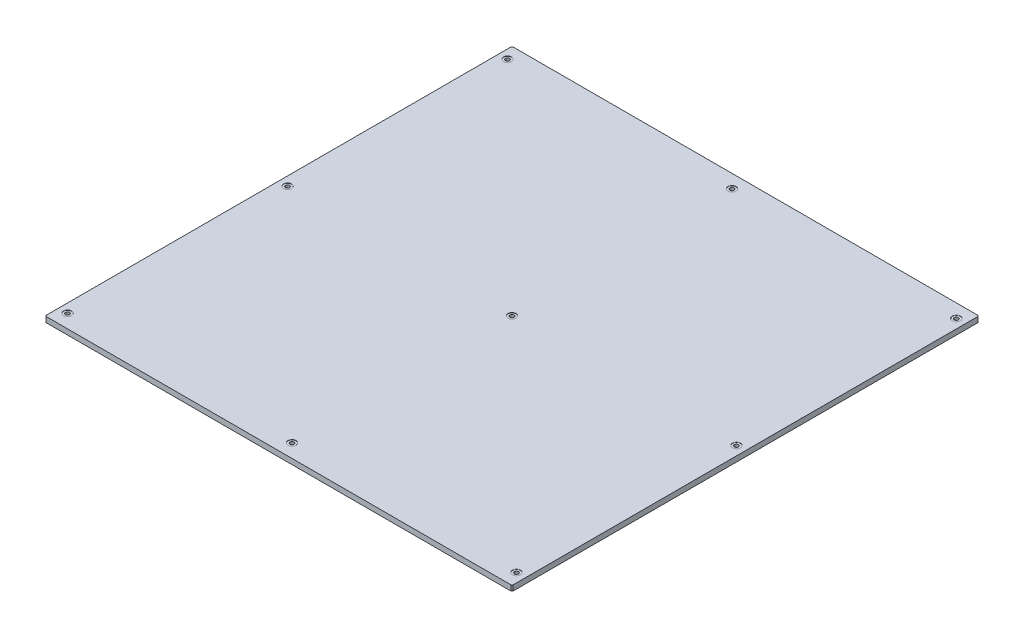
ISO-10303-21;
HEADER;
FILE_DESCRIPTION(('STEP AP214'),'2;1');
FILE_NAME('part.step','',(''),(''),'','','');
FILE_SCHEMA(('AUTOMOTIVE_DESIGN { 1 0 10303 214 1 1 1 1 }'));
ENDSEC;
DATA;
#1=APPLICATION_CONTEXT('core data for automotive mechanical design processes');
#2=APPLICATION_PROTOCOL_DEFINITION('international standard','automotive_design',2000,#1);
#3=PRODUCT_CONTEXT('',#1,'mechanical');
#4=PRODUCT('Part','Part','',(#3));
#5=PRODUCT_RELATED_PRODUCT_CATEGORY('part','',(#4));
#6=PRODUCT_DEFINITION_FORMATION('','',#4);
#7=PRODUCT_DEFINITION_CONTEXT('part definition',#1,'design');
#8=PRODUCT_DEFINITION('design','',#6,#7);
#9=PRODUCT_DEFINITION_SHAPE('','',#8);
#10=(LENGTH_UNIT() NAMED_UNIT(*) SI_UNIT(.MILLI.,.METRE.));
#11=(NAMED_UNIT(*) PLANE_ANGLE_UNIT() SI_UNIT($,.RADIAN.));
#12=(NAMED_UNIT(*) SI_UNIT($,.STERADIAN.) SOLID_ANGLE_UNIT());
#13=UNCERTAINTY_MEASURE_WITH_UNIT(LENGTH_MEASURE(1.E-05),#10,'distance_accuracy_value','');
#14=(GEOMETRIC_REPRESENTATION_CONTEXT(3) GLOBAL_UNCERTAINTY_ASSIGNED_CONTEXT((#13)) GLOBAL_UNIT_ASSIGNED_CONTEXT((#10,
#11,#12)) REPRESENTATION_CONTEXT('',''));
#15=CARTESIAN_POINT('',(0.,0.,0.));
#16=DIRECTION('',(0.,0.,1.));
#17=DIRECTION('',(1.,0.,0.));
#18=AXIS2_PLACEMENT_3D('',#15,#16,#17);
#19=CARTESIAN_POINT('',(520.,12.,-520.));
#20=DIRECTION('',(-1.,0.,0.));
#21=DIRECTION('',(0.,0.,1.));
#22=AXIS2_PLACEMENT_3D('',#19,#20,#21);
#23=PLANE('',#22);
#24=DIRECTION('',(0.,0.,-1.));
#25=VECTOR('',#24,1.);
#26=CARTESIAN_POINT('',(520.,0.,-520.));
#27=LINE('',#26,#25);
#28=CARTESIAN_POINT('',(520.,0.,518.));
#29=VERTEX_POINT('',#28);
#30=CARTESIAN_POINT('',(520.,0.,-518.));
#31=VERTEX_POINT('',#30);
#32=EDGE_CURVE('E134',#29,#31,#27,.T.);
#33=ORIENTED_EDGE('',*,*,#32,.T.);
#34=DIRECTION('',(0.,1.,0.));
#35=VECTOR('',#34,1.);
#36=CARTESIAN_POINT('',(520.,12.,-518.));
#37=LINE('',#36,#35);
#38=CARTESIAN_POINT('',(520.,12.,-518.));
#39=VERTEX_POINT('',#38);
#40=EDGE_CURVE('E112',#31,#39,#37,.T.);
#41=ORIENTED_EDGE('',*,*,#40,.T.);
#42=DIRECTION('',(0.,0.,-1.));
#43=VECTOR('',#42,1.);
#44=CARTESIAN_POINT('',(520.,12.,-520.));
#45=LINE('',#44,#43);
#46=CARTESIAN_POINT('',(520.,12.,518.));
#47=VERTEX_POINT('',#46);
#48=EDGE_CURVE('E144',#47,#39,#45,.T.);
#49=ORIENTED_EDGE('',*,*,#48,.F.);
#50=DIRECTION('',(0.,-1.,0.));
#51=VECTOR('',#50,1.);
#52=CARTESIAN_POINT('',(520.,12.,518.));
#53=LINE('',#52,#51);
#54=EDGE_CURVE('E117',#47,#29,#53,.T.);
#55=ORIENTED_EDGE('',*,*,#54,.T.);
#56=EDGE_LOOP('',(#33,#41,#49,#55));
#57=FACE_BOUND('',#56,.T.);
#58=ADVANCED_FACE('F40',(#57),#23,.F.);
#59=CARTESIAN_POINT('',(-520.,12.,-520.));
#60=DIRECTION('',(0.,0.,1.));
#61=DIRECTION('',(1.,0.,0.));
#62=AXIS2_PLACEMENT_3D('',#59,#60,#61);
#63=PLANE('',#62);
#64=DIRECTION('',(-1.,0.,0.));
#65=VECTOR('',#64,1.);
#66=CARTESIAN_POINT('',(-520.,12.,-520.));
#67=LINE('',#66,#65);
#68=CARTESIAN_POINT('',(518.,12.,-520.));
#69=VERTEX_POINT('',#68);
#70=CARTESIAN_POINT('',(-518.,12.,-520.));
#71=VERTEX_POINT('',#70);
#72=EDGE_CURVE('E127',#69,#71,#67,.T.);
#73=ORIENTED_EDGE('',*,*,#72,.F.);
#74=DIRECTION('',(0.,-1.,0.));
#75=VECTOR('',#74,1.);
#76=CARTESIAN_POINT('',(518.,12.,-520.));
#77=LINE('',#76,#75);
#78=CARTESIAN_POINT('',(518.,0.,-520.));
#79=VERTEX_POINT('',#78);
#80=EDGE_CURVE('E111',#69,#79,#77,.T.);
#81=ORIENTED_EDGE('',*,*,#80,.T.);
#82=DIRECTION('',(-1.,0.,0.));
#83=VECTOR('',#82,1.);
#84=CARTESIAN_POINT('',(-520.,0.,-520.));
#85=LINE('',#84,#83);
#86=CARTESIAN_POINT('',(-518.,0.,-520.));
#87=VERTEX_POINT('',#86);
#88=EDGE_CURVE('E124',#79,#87,#85,.T.);
#89=ORIENTED_EDGE('',*,*,#88,.T.);
#90=DIRECTION('',(0.,1.,0.));
#91=VECTOR('',#90,1.);
#92=CARTESIAN_POINT('',(-518.,12.,-520.));
#93=LINE('',#92,#91);
#94=EDGE_CURVE('E129',#87,#71,#93,.T.);
#95=ORIENTED_EDGE('',*,*,#94,.T.);
#96=EDGE_LOOP('',(#73,#81,#89,#95));
#97=FACE_BOUND('',#96,.T.);
#98=ADVANCED_FACE('F123',(#97),#63,.F.);
#99=CARTESIAN_POINT('',(-520.,12.,-520.));
#100=DIRECTION('',(1.,0.,0.));
#101=DIRECTION('',(0.,0.,-1.));
#102=AXIS2_PLACEMENT_3D('',#99,#100,#101);
#103=PLANE('',#102);
#104=DIRECTION('',(0.,0.,1.));
#105=VECTOR('',#104,1.);
#106=CARTESIAN_POINT('',(-520.,12.,-520.));
#107=LINE('',#106,#105);
#108=CARTESIAN_POINT('',(-520.,12.,-518.));
#109=VERTEX_POINT('',#108);
#110=CARTESIAN_POINT('',(-520.,12.,518.));
#111=VERTEX_POINT('',#110);
#112=EDGE_CURVE('E170',#109,#111,#107,.T.);
#113=ORIENTED_EDGE('',*,*,#112,.F.);
#114=DIRECTION('',(0.,-1.,0.));
#115=VECTOR('',#114,1.);
#116=CARTESIAN_POINT('',(-520.,12.,-518.));
#117=LINE('',#116,#115);
#118=CARTESIAN_POINT('',(-520.,0.,-518.));
#119=VERTEX_POINT('',#118);
#120=EDGE_CURVE('E163',#109,#119,#117,.T.);
#121=ORIENTED_EDGE('',*,*,#120,.T.);
#122=DIRECTION('',(0.,0.,1.));
#123=VECTOR('',#122,1.);
#124=CARTESIAN_POINT('',(-520.,0.,-520.));
#125=LINE('',#124,#123);
#126=CARTESIAN_POINT('',(-520.,0.,518.));
#127=VERTEX_POINT('',#126);
#128=EDGE_CURVE('E133',#119,#127,#125,.T.);
#129=ORIENTED_EDGE('',*,*,#128,.T.);
#130=DIRECTION('',(0.,1.,0.));
#131=VECTOR('',#130,1.);
#132=CARTESIAN_POINT('',(-520.,12.,518.));
#133=LINE('',#132,#131);
#134=EDGE_CURVE('E161',#127,#111,#133,.T.);
#135=ORIENTED_EDGE('',*,*,#134,.T.);
#136=EDGE_LOOP('',(#113,#121,#129,#135));
#137=FACE_BOUND('',#136,.T.);
#138=ADVANCED_FACE('F168',(#137),#103,.F.);
#139=CARTESIAN_POINT('',(-520.,12.,520.));
#140=DIRECTION('',(0.,0.,-1.));
#141=DIRECTION('',(-1.,0.,0.));
#142=AXIS2_PLACEMENT_3D('',#139,#140,#141);
#143=PLANE('',#142);
#144=DIRECTION('',(1.,0.,0.));
#145=VECTOR('',#144,1.);
#146=CARTESIAN_POINT('',(-520.,12.,520.));
#147=LINE('',#146,#145);
#148=CARTESIAN_POINT('',(-518.,12.,520.));
#149=VERTEX_POINT('',#148);
#150=CARTESIAN_POINT('',(518.,12.,520.));
#151=VERTEX_POINT('',#150);
#152=EDGE_CURVE('E145',#149,#151,#147,.T.);
#153=ORIENTED_EDGE('',*,*,#152,.F.);
#154=DIRECTION('',(0.,-1.,0.));
#155=VECTOR('',#154,1.);
#156=CARTESIAN_POINT('',(-518.,12.,520.));
#157=LINE('',#156,#155);
#158=CARTESIAN_POINT('',(-518.,0.,520.));
#159=VERTEX_POINT('',#158);
#160=EDGE_CURVE('E11',#149,#159,#157,.T.);
#161=ORIENTED_EDGE('',*,*,#160,.T.);
#162=DIRECTION('',(1.,0.,0.));
#163=VECTOR('',#162,1.);
#164=CARTESIAN_POINT('',(-520.,0.,520.));
#165=LINE('',#164,#163);
#166=CARTESIAN_POINT('',(518.,0.,520.));
#167=VERTEX_POINT('',#166);
#168=EDGE_CURVE('E137',#159,#167,#165,.T.);
#169=ORIENTED_EDGE('',*,*,#168,.T.);
#170=DIRECTION('',(0.,1.,0.));
#171=VECTOR('',#170,1.);
#172=CARTESIAN_POINT('',(518.,12.,520.));
#173=LINE('',#172,#171);
#174=EDGE_CURVE('E49',#167,#151,#173,.T.);
#175=ORIENTED_EDGE('',*,*,#174,.T.);
#176=EDGE_LOOP('',(#153,#161,#169,#175));
#177=FACE_BOUND('',#176,.T.);
#178=ADVANCED_FACE('F177',(#177),#143,.F.);
#179=CARTESIAN_POINT('',(0.,12.,0.));
#180=DIRECTION('',(0.,1.,0.));
#181=DIRECTION('',(0.,0.,1.));
#182=AXIS2_PLACEMENT_3D('',#179,#180,#181);
#183=PLANE('',#182);
#184=CARTESIAN_POINT('',(-500.,12.,-490.));
#185=DIRECTION('',(0.,1.,0.));
#186=DIRECTION('',(0.,0.,1.));
#187=AXIS2_PLACEMENT_3D('',#184,#185,#186);
#188=CIRCLE('',#187,9.02500000000001);
#189=CARTESIAN_POINT('',(-500.,12.,-480.975));
#190=VERTEX_POINT('',#189);
#191=EDGE_CURVE('E315',#190,#190,#188,.T.);
#192=ORIENTED_EDGE('',*,*,#191,.F.);
#193=EDGE_LOOP('',(#192));
#194=FACE_BOUND('',#193,.T.);
#195=CARTESIAN_POINT('',(-1.38777878078145E-13,12.,-490.));
#196=DIRECTION('',(0.,1.,0.));
#197=DIRECTION('',(0.,0.,1.));
#198=AXIS2_PLACEMENT_3D('',#195,#196,#197);
#199=CIRCLE('',#198,9.025);
#200=CARTESIAN_POINT('',(-1.38777878078145E-13,12.,-480.975));
#201=VERTEX_POINT('',#200);
#202=EDGE_CURVE('E300',#201,#201,#199,.T.);
#203=ORIENTED_EDGE('',*,*,#202,.F.);
#204=EDGE_LOOP('',(#203));
#205=FACE_BOUND('',#204,.T.);
#206=CARTESIAN_POINT('',(500.,12.,-490.));
#207=DIRECTION('',(0.,1.,0.));
#208=DIRECTION('',(0.,0.,1.));
#209=AXIS2_PLACEMENT_3D('',#206,#207,#208);
#210=CIRCLE('',#209,9.02499999999995);
#211=CARTESIAN_POINT('',(500.,12.,-480.975));
#212=VERTEX_POINT('',#211);
#213=EDGE_CURVE('E285',#212,#212,#210,.T.);
#214=ORIENTED_EDGE('',*,*,#213,.F.);
#215=EDGE_LOOP('',(#214));
#216=FACE_BOUND('',#215,.T.);
#217=CARTESIAN_POINT('',(-500.,12.,-1.66533453693773E-13));
#218=DIRECTION('',(0.,1.,0.));
#219=DIRECTION('',(0.,0.,1.));
#220=AXIS2_PLACEMENT_3D('',#217,#218,#219);
#221=CIRCLE('',#220,9.02500000000001);
#222=CARTESIAN_POINT('',(-500.,12.,9.02499999999984));
#223=VERTEX_POINT('',#222);
#224=EDGE_CURVE('E270',#223,#223,#221,.T.);
#225=ORIENTED_EDGE('',*,*,#224,.F.);
#226=EDGE_LOOP('',(#225));
#227=FACE_BOUND('',#226,.T.);
#228=CARTESIAN_POINT('',(-1.94289029309402E-13,12.,2.22044604925031E-13));
#229=DIRECTION('',(0.,1.,0.));
#230=DIRECTION('',(0.,0.,1.));
#231=AXIS2_PLACEMENT_3D('',#228,#229,#230);
#232=CIRCLE('',#231,9.025);
#233=CARTESIAN_POINT('',(-1.94289029309402E-13,12.,9.02500000000022));
#234=VERTEX_POINT('',#233);
#235=EDGE_CURVE('E255',#234,#234,#232,.T.);
#236=ORIENTED_EDGE('',*,*,#235,.F.);
#237=EDGE_LOOP('',(#236));
#238=FACE_BOUND('',#237,.T.);
#239=CARTESIAN_POINT('',(500.,12.,-1.66533453693773E-13));
#240=DIRECTION('',(0.,1.,0.));
#241=DIRECTION('',(0.,0.,1.));
#242=AXIS2_PLACEMENT_3D('',#239,#240,#241);
#243=CIRCLE('',#242,9.02499999999995);
#244=CARTESIAN_POINT('',(500.,12.,9.02499999999978));
#245=VERTEX_POINT('',#244);
#246=EDGE_CURVE('E240',#245,#245,#243,.T.);
#247=ORIENTED_EDGE('',*,*,#246,.F.);
#248=EDGE_LOOP('',(#247));
#249=FACE_BOUND('',#248,.T.);
#250=CARTESIAN_POINT('',(-500.,12.,490.));
#251=DIRECTION('',(0.,1.,0.));
#252=DIRECTION('',(0.,0.,1.));
#253=AXIS2_PLACEMENT_3D('',#250,#251,#252);
#254=CIRCLE('',#253,9.02500000000001);
#255=CARTESIAN_POINT('',(-500.,12.,499.025));
#256=VERTEX_POINT('',#255);
#257=EDGE_CURVE('E225',#256,#256,#254,.T.);
#258=ORIENTED_EDGE('',*,*,#257,.F.);
#259=EDGE_LOOP('',(#258));
#260=FACE_BOUND('',#259,.T.);
#261=CARTESIAN_POINT('',(3.05311331771918E-13,12.,490.));
#262=DIRECTION('',(0.,1.,0.));
#263=DIRECTION('',(0.,0.,1.));
#264=AXIS2_PLACEMENT_3D('',#261,#262,#263);
#265=CIRCLE('',#264,9.025);
#266=CARTESIAN_POINT('',(3.05311331771918E-13,12.,499.025));
#267=VERTEX_POINT('',#266);
#268=EDGE_CURVE('E210',#267,#267,#265,.T.);
#269=ORIENTED_EDGE('',*,*,#268,.F.);
#270=EDGE_LOOP('',(#269));
#271=FACE_BOUND('',#270,.T.);
#272=CARTESIAN_POINT('',(500.,12.,490.));
#273=DIRECTION('',(0.,1.,0.));
#274=DIRECTION('',(0.,0.,1.));
#275=AXIS2_PLACEMENT_3D('',#272,#273,#274);
#276=CIRCLE('',#275,9.02499999999995);
#277=CARTESIAN_POINT('',(500.,12.,499.025));
#278=VERTEX_POINT('',#277);
#279=EDGE_CURVE('E195',#278,#278,#276,.T.);
#280=ORIENTED_EDGE('',*,*,#279,.F.);
#281=EDGE_LOOP('',(#280));
#282=FACE_BOUND('',#281,.T.);
#283=ORIENTED_EDGE('',*,*,#48,.T.);
#284=DIRECTION('',(0.707106781186548,0.,0.707106781186548));
#285=VECTOR('',#284,1.);
#286=CARTESIAN_POINT('',(519.,12.,-519.));
#287=LINE('',#286,#285);
#288=EDGE_CURVE('E159',#39,#69,#287,.F.);
#289=ORIENTED_EDGE('',*,*,#288,.T.);
#290=ORIENTED_EDGE('',*,*,#72,.T.);
#291=DIRECTION('',(0.707106781186548,0.,-0.707106781186548));
#292=VECTOR('',#291,1.);
#293=CARTESIAN_POINT('',(-519.,12.,-519.));
#294=LINE('',#293,#292);
#295=EDGE_CURVE('E157',#71,#109,#294,.F.);
#296=ORIENTED_EDGE('',*,*,#295,.T.);
#297=ORIENTED_EDGE('',*,*,#112,.T.);
#298=DIRECTION('',(-0.707106781186548,0.,-0.707106781186548));
#299=VECTOR('',#298,1.);
#300=CARTESIAN_POINT('',(-519.,12.,519.));
#301=LINE('',#300,#299);
#302=EDGE_CURVE('E62',#111,#149,#301,.F.);
#303=ORIENTED_EDGE('',*,*,#302,.T.);
#304=ORIENTED_EDGE('',*,*,#152,.T.);
#305=DIRECTION('',(-0.707106781186548,0.,0.707106781186548));
#306=VECTOR('',#305,1.);
#307=CARTESIAN_POINT('',(519.,12.,519.));
#308=LINE('',#307,#306);
#309=EDGE_CURVE('E154',#151,#47,#308,.F.);
#310=ORIENTED_EDGE('',*,*,#309,.T.);
#311=EDGE_LOOP('',(#283,#289,#290,#296,#297,#303,#304,#310));
#312=FACE_BOUND('',#311,.T.);
#313=ADVANCED_FACE('F321',(#194,#205,#216,#227,#238,#249,#260,#271,#282,#312),#183,.T.);
#314=CARTESIAN_POINT('',(0.,0.,0.));
#315=DIRECTION('',(0.,1.,0.));
#316=DIRECTION('',(0.,0.,1.));
#317=AXIS2_PLACEMENT_3D('',#314,#315,#316);
#318=PLANE('',#317);
#319=CARTESIAN_POINT('',(-500.,0.,-490.));
#320=DIRECTION('',(0.,1.,0.));
#321=DIRECTION('',(0.,0.,1.));
#322=AXIS2_PLACEMENT_3D('',#319,#320,#321);
#323=CIRCLE('',#322,4.50000000000012);
#324=CARTESIAN_POINT('',(-500.,0.,-485.5));
#325=VERTEX_POINT('',#324);
#326=EDGE_CURVE('E303',#325,#325,#323,.T.);
#327=ORIENTED_EDGE('',*,*,#326,.T.);
#328=EDGE_LOOP('',(#327));
#329=FACE_BOUND('',#328,.T.);
#330=CARTESIAN_POINT('',(-1.38777878078145E-13,0.,-490.));
#331=DIRECTION('',(0.,1.,0.));
#332=DIRECTION('',(0.,0.,1.));
#333=AXIS2_PLACEMENT_3D('',#330,#331,#332);
#334=CIRCLE('',#333,4.5000000000001);
#335=CARTESIAN_POINT('',(-1.38777878078145E-13,0.,-485.5));
#336=VERTEX_POINT('',#335);
#337=EDGE_CURVE('E288',#336,#336,#334,.T.);
#338=ORIENTED_EDGE('',*,*,#337,.T.);
#339=EDGE_LOOP('',(#338));
#340=FACE_BOUND('',#339,.T.);
#341=CARTESIAN_POINT('',(500.,0.,-490.));
#342=DIRECTION('',(0.,1.,0.));
#343=DIRECTION('',(0.,0.,1.));
#344=AXIS2_PLACEMENT_3D('',#341,#342,#343);
#345=CIRCLE('',#344,4.50000000000006);
#346=CARTESIAN_POINT('',(500.,0.,-485.5));
#347=VERTEX_POINT('',#346);
#348=EDGE_CURVE('E273',#347,#347,#345,.T.);
#349=ORIENTED_EDGE('',*,*,#348,.T.);
#350=EDGE_LOOP('',(#349));
#351=FACE_BOUND('',#350,.T.);
#352=CARTESIAN_POINT('',(-500.,0.,-1.66533453693773E-13));
#353=DIRECTION('',(0.,1.,0.));
#354=DIRECTION('',(0.,0.,1.));
#355=AXIS2_PLACEMENT_3D('',#352,#353,#354);
#356=CIRCLE('',#355,4.50000000000012);
#357=CARTESIAN_POINT('',(-500.,0.,4.49999999999995));
#358=VERTEX_POINT('',#357);
#359=EDGE_CURVE('E258',#358,#358,#356,.T.);
#360=ORIENTED_EDGE('',*,*,#359,.T.);
#361=EDGE_LOOP('',(#360));
#362=FACE_BOUND('',#361,.T.);
#363=CARTESIAN_POINT('',(-1.94289029309402E-13,0.,2.22044604925031E-13));
#364=DIRECTION('',(0.,1.,0.));
#365=DIRECTION('',(0.,0.,1.));
#366=AXIS2_PLACEMENT_3D('',#363,#364,#365);
#367=CIRCLE('',#366,4.5000000000001);
#368=CARTESIAN_POINT('',(-1.94289029309402E-13,0.,4.50000000000032));
#369=VERTEX_POINT('',#368);
#370=EDGE_CURVE('E243',#369,#369,#367,.T.);
#371=ORIENTED_EDGE('',*,*,#370,.T.);
#372=EDGE_LOOP('',(#371));
#373=FACE_BOUND('',#372,.T.);
#374=CARTESIAN_POINT('',(500.,0.,-1.66533453693773E-13));
#375=DIRECTION('',(0.,1.,0.));
#376=DIRECTION('',(0.,0.,1.));
#377=AXIS2_PLACEMENT_3D('',#374,#375,#376);
#378=CIRCLE('',#377,4.50000000000006);
#379=CARTESIAN_POINT('',(500.,0.,4.49999999999989));
#380=VERTEX_POINT('',#379);
#381=EDGE_CURVE('E228',#380,#380,#378,.T.);
#382=ORIENTED_EDGE('',*,*,#381,.T.);
#383=EDGE_LOOP('',(#382));
#384=FACE_BOUND('',#383,.T.);
#385=CARTESIAN_POINT('',(-500.,0.,490.));
#386=DIRECTION('',(0.,1.,0.));
#387=DIRECTION('',(0.,0.,1.));
#388=AXIS2_PLACEMENT_3D('',#385,#386,#387);
#389=CIRCLE('',#388,4.50000000000012);
#390=CARTESIAN_POINT('',(-500.,0.,494.5));
#391=VERTEX_POINT('',#390);
#392=EDGE_CURVE('E213',#391,#391,#389,.T.);
#393=ORIENTED_EDGE('',*,*,#392,.T.);
#394=EDGE_LOOP('',(#393));
#395=FACE_BOUND('',#394,.T.);
#396=CARTESIAN_POINT('',(3.05311331771918E-13,0.,490.));
#397=DIRECTION('',(0.,1.,0.));
#398=DIRECTION('',(0.,0.,1.));
#399=AXIS2_PLACEMENT_3D('',#396,#397,#398);
#400=CIRCLE('',#399,4.5000000000001);
#401=CARTESIAN_POINT('',(3.05311331771918E-13,0.,494.5));
#402=VERTEX_POINT('',#401);
#403=EDGE_CURVE('E198',#402,#402,#400,.T.);
#404=ORIENTED_EDGE('',*,*,#403,.T.);
#405=EDGE_LOOP('',(#404));
#406=FACE_BOUND('',#405,.T.);
#407=CARTESIAN_POINT('',(500.,0.,490.));
#408=DIRECTION('',(0.,1.,0.));
#409=DIRECTION('',(0.,0.,1.));
#410=AXIS2_PLACEMENT_3D('',#407,#408,#409);
#411=CIRCLE('',#410,4.50000000000006);
#412=CARTESIAN_POINT('',(500.,0.,494.5));
#413=VERTEX_POINT('',#412);
#414=EDGE_CURVE('E139',#413,#413,#411,.T.);
#415=ORIENTED_EDGE('',*,*,#414,.T.);
#416=EDGE_LOOP('',(#415));
#417=FACE_BOUND('',#416,.T.);
#418=ORIENTED_EDGE('',*,*,#88,.F.);
#419=DIRECTION('',(-0.707106781186548,0.,-0.707106781186548));
#420=VECTOR('',#419,1.);
#421=CARTESIAN_POINT('',(518.,0.,-520.));
#422=LINE('',#421,#420);
#423=EDGE_CURVE('E107',#79,#31,#422,.F.);
#424=ORIENTED_EDGE('',*,*,#423,.T.);
#425=ORIENTED_EDGE('',*,*,#32,.F.);
#426=DIRECTION('',(0.707106781186548,0.,-0.707106781186548));
#427=VECTOR('',#426,1.);
#428=CARTESIAN_POINT('',(520.,0.,518.));
#429=LINE('',#428,#427);
#430=EDGE_CURVE('E128',#29,#167,#429,.F.);
#431=ORIENTED_EDGE('',*,*,#430,.T.);
#432=ORIENTED_EDGE('',*,*,#168,.F.);
#433=DIRECTION('',(0.707106781186548,0.,0.707106781186548));
#434=VECTOR('',#433,1.);
#435=CARTESIAN_POINT('',(-518.,0.,520.));
#436=LINE('',#435,#434);
#437=EDGE_CURVE('E148',#159,#127,#436,.F.);
#438=ORIENTED_EDGE('',*,*,#437,.T.);
#439=ORIENTED_EDGE('',*,*,#128,.F.);
#440=DIRECTION('',(-0.707106781186548,0.,0.707106781186548));
#441=VECTOR('',#440,1.);
#442=CARTESIAN_POINT('',(-520.,0.,-518.));
#443=LINE('',#442,#441);
#444=EDGE_CURVE('E118',#119,#87,#443,.F.);
#445=ORIENTED_EDGE('',*,*,#444,.T.);
#446=EDGE_LOOP('',(#418,#424,#425,#431,#432,#438,#439,#445));
#447=FACE_BOUND('',#446,.T.);
#448=ADVANCED_FACE('F131',(#329,#340,#351,#362,#373,#384,#395,#406,#417,#447),#318,.F.);
#449=CARTESIAN_POINT('',(518.,12.,-520.));
#450=DIRECTION('',(-0.707106781186547,0.,0.707106781186547));
#451=DIRECTION('',(0.,-1.,0.));
#452=AXIS2_PLACEMENT_3D('',#449,#450,#451);
#453=PLANE('',#452);
#454=ORIENTED_EDGE('',*,*,#288,.F.);
#455=ORIENTED_EDGE('',*,*,#40,.F.);
#456=ORIENTED_EDGE('',*,*,#423,.F.);
#457=ORIENTED_EDGE('',*,*,#80,.F.);
#458=EDGE_LOOP('',(#454,#455,#456,#457));
#459=FACE_BOUND('',#458,.T.);
#460=ADVANCED_FACE('F110',(#459),#453,.F.);
#461=CARTESIAN_POINT('',(-520.,12.,-518.));
#462=DIRECTION('',(0.707106781186548,0.,0.707106781186548));
#463=DIRECTION('',(0.,-1.,0.));
#464=AXIS2_PLACEMENT_3D('',#461,#462,#463);
#465=PLANE('',#464);
#466=ORIENTED_EDGE('',*,*,#295,.F.);
#467=ORIENTED_EDGE('',*,*,#94,.F.);
#468=ORIENTED_EDGE('',*,*,#444,.F.);
#469=ORIENTED_EDGE('',*,*,#120,.F.);
#470=EDGE_LOOP('',(#466,#467,#468,#469));
#471=FACE_BOUND('',#470,.T.);
#472=ADVANCED_FACE('F353',(#471),#465,.F.);
#473=CARTESIAN_POINT('',(-518.,12.,520.));
#474=DIRECTION('',(0.707106781186547,0.,-0.707106781186547));
#475=DIRECTION('',(0.,-1.,0.));
#476=AXIS2_PLACEMENT_3D('',#473,#474,#475);
#477=PLANE('',#476);
#478=ORIENTED_EDGE('',*,*,#302,.F.);
#479=ORIENTED_EDGE('',*,*,#134,.F.);
#480=ORIENTED_EDGE('',*,*,#437,.F.);
#481=ORIENTED_EDGE('',*,*,#160,.F.);
#482=EDGE_LOOP('',(#478,#479,#480,#481));
#483=FACE_BOUND('',#482,.T.);
#484=ADVANCED_FACE('F176',(#483),#477,.F.);
#485=CARTESIAN_POINT('',(520.,12.,518.));
#486=DIRECTION('',(-0.707106781186548,0.,-0.707106781186548));
#487=DIRECTION('',(0.,-1.,0.));
#488=AXIS2_PLACEMENT_3D('',#485,#486,#487);
#489=PLANE('',#488);
#490=ORIENTED_EDGE('',*,*,#309,.F.);
#491=ORIENTED_EDGE('',*,*,#174,.F.);
#492=ORIENTED_EDGE('',*,*,#430,.F.);
#493=ORIENTED_EDGE('',*,*,#54,.F.);
#494=EDGE_LOOP('',(#490,#491,#492,#493));
#495=FACE_BOUND('',#494,.T.);
#496=ADVANCED_FACE('F43',(#495),#489,.F.);
#497=CARTESIAN_POINT('',(500.,12.,490.));
#498=DIRECTION('',(0.,1.,0.));
#499=DIRECTION('',(0.,0.,1.));
#500=AXIS2_PLACEMENT_3D('',#497,#498,#499);
#501=CYLINDRICAL_SURFACE('',#500,4.50000000000006);
#502=ORIENTED_EDGE('',*,*,#414,.F.);
#503=EDGE_LOOP('',(#502));
#504=FACE_BOUND('',#503,.T.);
#505=CARTESIAN_POINT('',(500.,11.5,490.));
#506=DIRECTION('',(0.,1.,0.));
#507=DIRECTION('',(0.,0.,1.));
#508=AXIS2_PLACEMENT_3D('',#505,#506,#507);
#509=CIRCLE('',#508,4.50000000000006);
#510=CARTESIAN_POINT('',(500.,11.5,494.5));
#511=VERTEX_POINT('',#510);
#512=EDGE_CURVE('E186',#511,#511,#509,.T.);
#513=ORIENTED_EDGE('',*,*,#512,.T.);
#514=EDGE_LOOP('',(#513));
#515=FACE_BOUND('',#514,.T.);
#516=ADVANCED_FACE('F345',(#504,#515),#501,.F.);
#517=CARTESIAN_POINT('',(509.,11.5,490.));
#518=DIRECTION('',(0.,-1.,0.));
#519=DIRECTION('',(0.,0.,-1.));
#520=AXIS2_PLACEMENT_3D('',#517,#518,#519);
#521=PLANE('',#520);
#522=ORIENTED_EDGE('',*,*,#512,.F.);
#523=EDGE_LOOP('',(#522));
#524=FACE_BOUND('',#523,.T.);
#525=CARTESIAN_POINT('',(500.,11.5,490.));
#526=DIRECTION('',(0.,1.,0.));
#527=DIRECTION('',(0.,0.,1.));
#528=AXIS2_PLACEMENT_3D('',#525,#526,#527);
#529=CIRCLE('',#528,9.00000000000001);
#530=CARTESIAN_POINT('',(500.,11.5,499.));
#531=VERTEX_POINT('',#530);
#532=EDGE_CURVE('E189',#531,#531,#529,.T.);
#533=ORIENTED_EDGE('',*,*,#532,.T.);
#534=EDGE_LOOP('',(#533));
#535=FACE_BOUND('',#534,.T.);
#536=ADVANCED_FACE('F350',(#524,#535),#521,.F.);
#537=CARTESIAN_POINT('',(500.,12.,490.));
#538=DIRECTION('',(0.,1.,0.));
#539=DIRECTION('',(0.,0.,1.));
#540=AXIS2_PLACEMENT_3D('',#537,#538,#539);
#541=CYLINDRICAL_SURFACE('',#540,9.00000000000001);
#542=ORIENTED_EDGE('',*,*,#532,.F.);
#543=EDGE_LOOP('',(#542));
#544=FACE_BOUND('',#543,.T.);
#545=CARTESIAN_POINT('',(500.,11.975,490.));
#546=DIRECTION('',(0.,1.,0.));
#547=DIRECTION('',(0.,0.,1.));
#548=AXIS2_PLACEMENT_3D('',#545,#546,#547);
#549=CIRCLE('',#548,9.00000000000001);
#550=CARTESIAN_POINT('',(500.,11.975,499.));
#551=VERTEX_POINT('',#550);
#552=EDGE_CURVE('E192',#551,#551,#549,.T.);
#553=ORIENTED_EDGE('',*,*,#552,.T.);
#554=EDGE_LOOP('',(#553));
#555=FACE_BOUND('',#554,.T.);
#556=ADVANCED_FACE('F415',(#544,#555),#541,.F.);
#557=CARTESIAN_POINT('',(500.,12.,490.));
#558=DIRECTION('',(0.,1.,0.));
#559=DIRECTION('',(0.,0.,1.));
#560=AXIS2_PLACEMENT_3D('',#557,#558,#559);
#561=CONICAL_SURFACE('',#560,9.02499999999995,0.785398163396234);
#562=ORIENTED_EDGE('',*,*,#552,.F.);
#563=EDGE_LOOP('',(#562));
#564=FACE_BOUND('',#563,.T.);
#565=ORIENTED_EDGE('',*,*,#279,.T.);
#566=EDGE_LOOP('',(#565));
#567=FACE_BOUND('',#566,.T.);
#568=ADVANCED_FACE('F425',(#564,#567),#561,.F.);
#569=CARTESIAN_POINT('',(3.05311331771918E-13,12.,490.));
#570=DIRECTION('',(0.,1.,0.));
#571=DIRECTION('',(0.,0.,1.));
#572=AXIS2_PLACEMENT_3D('',#569,#570,#571);
#573=CYLINDRICAL_SURFACE('',#572,4.5000000000001);
#574=ORIENTED_EDGE('',*,*,#403,.F.);
#575=EDGE_LOOP('',(#574));
#576=FACE_BOUND('',#575,.T.);
#577=CARTESIAN_POINT('',(3.05311331771918E-13,11.5,490.));
#578=DIRECTION('',(0.,1.,0.));
#579=DIRECTION('',(0.,0.,1.));
#580=AXIS2_PLACEMENT_3D('',#577,#578,#579);
#581=CIRCLE('',#580,4.5000000000001);
#582=CARTESIAN_POINT('',(3.05311331771918E-13,11.5,494.5));
#583=VERTEX_POINT('',#582);
#584=EDGE_CURVE('E201',#583,#583,#581,.T.);
#585=ORIENTED_EDGE('',*,*,#584,.T.);
#586=EDGE_LOOP('',(#585));
#587=FACE_BOUND('',#586,.T.);
#588=ADVANCED_FACE('F435',(#576,#587),#573,.F.);
#589=CARTESIAN_POINT('',(9.0000000000003,11.5,490.));
#590=DIRECTION('',(0.,-1.,0.));
#591=DIRECTION('',(0.,0.,-1.));
#592=AXIS2_PLACEMENT_3D('',#589,#590,#591);
#593=PLANE('',#592);
#594=ORIENTED_EDGE('',*,*,#584,.F.);
#595=EDGE_LOOP('',(#594));
#596=FACE_BOUND('',#595,.T.);
#597=CARTESIAN_POINT('',(3.05311331771918E-13,11.5,490.));
#598=DIRECTION('',(0.,1.,0.));
#599=DIRECTION('',(0.,0.,1.));
#600=AXIS2_PLACEMENT_3D('',#597,#598,#599);
#601=CIRCLE('',#600,9.);
#602=CARTESIAN_POINT('',(3.05311331771918E-13,11.5,499.));
#603=VERTEX_POINT('',#602);
#604=EDGE_CURVE('E204',#603,#603,#601,.T.);
#605=ORIENTED_EDGE('',*,*,#604,.T.);
#606=EDGE_LOOP('',(#605));
#607=FACE_BOUND('',#606,.T.);
#608=ADVANCED_FACE('F445',(#596,#607),#593,.F.);
#609=CARTESIAN_POINT('',(3.05311331771918E-13,12.,490.));
#610=DIRECTION('',(0.,1.,0.));
#611=DIRECTION('',(0.,0.,1.));
#612=AXIS2_PLACEMENT_3D('',#609,#610,#611);
#613=CYLINDRICAL_SURFACE('',#612,9.);
#614=ORIENTED_EDGE('',*,*,#604,.F.);
#615=EDGE_LOOP('',(#614));
#616=FACE_BOUND('',#615,.T.);
#617=CARTESIAN_POINT('',(3.05311331771918E-13,11.975,490.));
#618=DIRECTION('',(0.,1.,0.));
#619=DIRECTION('',(0.,0.,1.));
#620=AXIS2_PLACEMENT_3D('',#617,#618,#619);
#621=CIRCLE('',#620,9.);
#622=CARTESIAN_POINT('',(3.05311331771918E-13,11.975,499.));
#623=VERTEX_POINT('',#622);
#624=EDGE_CURVE('E207',#623,#623,#621,.T.);
#625=ORIENTED_EDGE('',*,*,#624,.T.);
#626=EDGE_LOOP('',(#625));
#627=FACE_BOUND('',#626,.T.);
#628=ADVANCED_FACE('F455',(#616,#627),#613,.F.);
#629=CARTESIAN_POINT('',(3.05311331771918E-13,12.,490.));
#630=DIRECTION('',(0.,1.,0.));
#631=DIRECTION('',(0.,0.,1.));
#632=AXIS2_PLACEMENT_3D('',#629,#630,#631);
#633=CONICAL_SURFACE('',#632,9.025,0.785398163397344);
#634=ORIENTED_EDGE('',*,*,#624,.F.);
#635=EDGE_LOOP('',(#634));
#636=FACE_BOUND('',#635,.T.);
#637=ORIENTED_EDGE('',*,*,#268,.T.);
#638=EDGE_LOOP('',(#637));
#639=FACE_BOUND('',#638,.T.);
#640=ADVANCED_FACE('F465',(#636,#639),#633,.F.);
#641=CARTESIAN_POINT('',(-500.,12.,490.));
#642=DIRECTION('',(0.,1.,0.));
#643=DIRECTION('',(0.,0.,1.));
#644=AXIS2_PLACEMENT_3D('',#641,#642,#643);
#645=CYLINDRICAL_SURFACE('',#644,4.50000000000012);
#646=ORIENTED_EDGE('',*,*,#392,.F.);
#647=EDGE_LOOP('',(#646));
#648=FACE_BOUND('',#647,.T.);
#649=CARTESIAN_POINT('',(-500.,11.5,490.));
#650=DIRECTION('',(0.,1.,0.));
#651=DIRECTION('',(0.,0.,1.));
#652=AXIS2_PLACEMENT_3D('',#649,#650,#651);
#653=CIRCLE('',#652,4.50000000000012);
#654=CARTESIAN_POINT('',(-500.,11.5,494.5));
#655=VERTEX_POINT('',#654);
#656=EDGE_CURVE('E216',#655,#655,#653,.T.);
#657=ORIENTED_EDGE('',*,*,#656,.T.);
#658=EDGE_LOOP('',(#657));
#659=FACE_BOUND('',#658,.T.);
#660=ADVANCED_FACE('F475',(#648,#659),#645,.F.);
#661=CARTESIAN_POINT('',(-491.,11.5,490.));
#662=DIRECTION('',(0.,-1.,0.));
#663=DIRECTION('',(0.,0.,-1.));
#664=AXIS2_PLACEMENT_3D('',#661,#662,#663);
#665=PLANE('',#664);
#666=ORIENTED_EDGE('',*,*,#656,.F.);
#667=EDGE_LOOP('',(#666));
#668=FACE_BOUND('',#667,.T.);
#669=CARTESIAN_POINT('',(-500.,11.5,490.));
#670=DIRECTION('',(0.,1.,0.));
#671=DIRECTION('',(0.,0.,1.));
#672=AXIS2_PLACEMENT_3D('',#669,#670,#671);
#673=CIRCLE('',#672,9.00000000000001);
#674=CARTESIAN_POINT('',(-500.,11.5,499.));
#675=VERTEX_POINT('',#674);
#676=EDGE_CURVE('E219',#675,#675,#673,.T.);
#677=ORIENTED_EDGE('',*,*,#676,.T.);
#678=EDGE_LOOP('',(#677));
#679=FACE_BOUND('',#678,.T.);
#680=ADVANCED_FACE('F485',(#668,#679),#665,.F.);
#681=CARTESIAN_POINT('',(-500.,12.,490.));
#682=DIRECTION('',(0.,1.,0.));
#683=DIRECTION('',(0.,0.,1.));
#684=AXIS2_PLACEMENT_3D('',#681,#682,#683);
#685=CYLINDRICAL_SURFACE('',#684,9.00000000000001);
#686=ORIENTED_EDGE('',*,*,#676,.F.);
#687=EDGE_LOOP('',(#686));
#688=FACE_BOUND('',#687,.T.);
#689=CARTESIAN_POINT('',(-500.,11.975,490.));
#690=DIRECTION('',(0.,1.,0.));
#691=DIRECTION('',(0.,0.,1.));
#692=AXIS2_PLACEMENT_3D('',#689,#690,#691);
#693=CIRCLE('',#692,9.00000000000001);
#694=CARTESIAN_POINT('',(-500.,11.975,499.));
#695=VERTEX_POINT('',#694);
#696=EDGE_CURVE('E222',#695,#695,#693,.T.);
#697=ORIENTED_EDGE('',*,*,#696,.T.);
#698=EDGE_LOOP('',(#697));
#699=FACE_BOUND('',#698,.T.);
#700=ADVANCED_FACE('F495',(#688,#699),#685,.F.);
#701=CARTESIAN_POINT('',(-500.,12.,490.));
#702=DIRECTION('',(0.,1.,0.));
#703=DIRECTION('',(0.,0.,1.));
#704=AXIS2_PLACEMENT_3D('',#701,#702,#703);
#705=CONICAL_SURFACE('',#704,9.02500000000001,0.785398163397344);
#706=ORIENTED_EDGE('',*,*,#696,.F.);
#707=EDGE_LOOP('',(#706));
#708=FACE_BOUND('',#707,.T.);
#709=ORIENTED_EDGE('',*,*,#257,.T.);
#710=EDGE_LOOP('',(#709));
#711=FACE_BOUND('',#710,.T.);
#712=ADVANCED_FACE('F505',(#708,#711),#705,.F.);
#713=CARTESIAN_POINT('',(500.,12.,-1.66533453693773E-13));
#714=DIRECTION('',(0.,1.,0.));
#715=DIRECTION('',(0.,0.,1.));
#716=AXIS2_PLACEMENT_3D('',#713,#714,#715);
#717=CYLINDRICAL_SURFACE('',#716,4.50000000000006);
#718=ORIENTED_EDGE('',*,*,#381,.F.);
#719=EDGE_LOOP('',(#718));
#720=FACE_BOUND('',#719,.T.);
#721=CARTESIAN_POINT('',(500.,11.5,-1.66533453693773E-13));
#722=DIRECTION('',(0.,1.,0.));
#723=DIRECTION('',(0.,0.,1.));
#724=AXIS2_PLACEMENT_3D('',#721,#722,#723);
#725=CIRCLE('',#724,4.50000000000006);
#726=CARTESIAN_POINT('',(500.,11.5,4.49999999999989));
#727=VERTEX_POINT('',#726);
#728=EDGE_CURVE('E231',#727,#727,#725,.T.);
#729=ORIENTED_EDGE('',*,*,#728,.T.);
#730=EDGE_LOOP('',(#729));
#731=FACE_BOUND('',#730,.T.);
#732=ADVANCED_FACE('F515',(#720,#731),#717,.F.);
#733=CARTESIAN_POINT('',(509.,11.5,-1.66533453693773E-13));
#734=DIRECTION('',(0.,-1.,0.));
#735=DIRECTION('',(0.,0.,-1.));
#736=AXIS2_PLACEMENT_3D('',#733,#734,#735);
#737=PLANE('',#736);
#738=ORIENTED_EDGE('',*,*,#728,.F.);
#739=EDGE_LOOP('',(#738));
#740=FACE_BOUND('',#739,.T.);
#741=CARTESIAN_POINT('',(500.,11.5,-1.66533453693773E-13));
#742=DIRECTION('',(0.,1.,0.));
#743=DIRECTION('',(0.,0.,1.));
#744=AXIS2_PLACEMENT_3D('',#741,#742,#743);
#745=CIRCLE('',#744,9.00000000000001);
#746=CARTESIAN_POINT('',(500.,11.5,8.99999999999984));
#747=VERTEX_POINT('',#746);
#748=EDGE_CURVE('E234',#747,#747,#745,.T.);
#749=ORIENTED_EDGE('',*,*,#748,.T.);
#750=EDGE_LOOP('',(#749));
#751=FACE_BOUND('',#750,.T.);
#752=ADVANCED_FACE('F525',(#740,#751),#737,.F.);
#753=CARTESIAN_POINT('',(500.,12.,-1.66533453693773E-13));
#754=DIRECTION('',(0.,1.,0.));
#755=DIRECTION('',(0.,0.,1.));
#756=AXIS2_PLACEMENT_3D('',#753,#754,#755);
#757=CYLINDRICAL_SURFACE('',#756,9.00000000000001);
#758=ORIENTED_EDGE('',*,*,#748,.F.);
#759=EDGE_LOOP('',(#758));
#760=FACE_BOUND('',#759,.T.);
#761=CARTESIAN_POINT('',(500.,11.975,-1.66533453693773E-13));
#762=DIRECTION('',(0.,1.,0.));
#763=DIRECTION('',(0.,0.,1.));
#764=AXIS2_PLACEMENT_3D('',#761,#762,#763);
#765=CIRCLE('',#764,9.00000000000001);
#766=CARTESIAN_POINT('',(500.,11.975,8.99999999999984));
#767=VERTEX_POINT('',#766);
#768=EDGE_CURVE('E237',#767,#767,#765,.T.);
#769=ORIENTED_EDGE('',*,*,#768,.T.);
#770=EDGE_LOOP('',(#769));
#771=FACE_BOUND('',#770,.T.);
#772=ADVANCED_FACE('F535',(#760,#771),#757,.F.);
#773=CARTESIAN_POINT('',(500.,12.,-1.66533453693773E-13));
#774=DIRECTION('',(0.,1.,0.));
#775=DIRECTION('',(0.,0.,1.));
#776=AXIS2_PLACEMENT_3D('',#773,#774,#775);
#777=CONICAL_SURFACE('',#776,9.02499999999995,0.785398163396234);
#778=ORIENTED_EDGE('',*,*,#768,.F.);
#779=EDGE_LOOP('',(#778));
#780=FACE_BOUND('',#779,.T.);
#781=ORIENTED_EDGE('',*,*,#246,.T.);
#782=EDGE_LOOP('',(#781));
#783=FACE_BOUND('',#782,.T.);
#784=ADVANCED_FACE('F545',(#780,#783),#777,.F.);
#785=CARTESIAN_POINT('',(-1.94289029309402E-13,12.,2.22044604925031E-13));
#786=DIRECTION('',(0.,1.,0.));
#787=DIRECTION('',(0.,0.,1.));
#788=AXIS2_PLACEMENT_3D('',#785,#786,#787);
#789=CYLINDRICAL_SURFACE('',#788,4.5000000000001);
#790=ORIENTED_EDGE('',*,*,#370,.F.);
#791=EDGE_LOOP('',(#790));
#792=FACE_BOUND('',#791,.T.);
#793=CARTESIAN_POINT('',(-1.94289029309402E-13,11.5,2.22044604925031E-13));
#794=DIRECTION('',(0.,1.,0.));
#795=DIRECTION('',(0.,0.,1.));
#796=AXIS2_PLACEMENT_3D('',#793,#794,#795);
#797=CIRCLE('',#796,4.5000000000001);
#798=CARTESIAN_POINT('',(-1.94289029309402E-13,11.5,4.50000000000032));
#799=VERTEX_POINT('',#798);
#800=EDGE_CURVE('E246',#799,#799,#797,.T.);
#801=ORIENTED_EDGE('',*,*,#800,.T.);
#802=EDGE_LOOP('',(#801));
#803=FACE_BOUND('',#802,.T.);
#804=ADVANCED_FACE('F555',(#792,#803),#789,.F.);
#805=CARTESIAN_POINT('',(8.9999999999998,11.5,2.22044604925031E-13));
#806=DIRECTION('',(0.,-1.,0.));
#807=DIRECTION('',(0.,0.,-1.));
#808=AXIS2_PLACEMENT_3D('',#805,#806,#807);
#809=PLANE('',#808);
#810=ORIENTED_EDGE('',*,*,#800,.F.);
#811=EDGE_LOOP('',(#810));
#812=FACE_BOUND('',#811,.T.);
#813=CARTESIAN_POINT('',(-1.94289029309402E-13,11.5,2.22044604925031E-13));
#814=DIRECTION('',(0.,1.,0.));
#815=DIRECTION('',(0.,0.,1.));
#816=AXIS2_PLACEMENT_3D('',#813,#814,#815);
#817=CIRCLE('',#816,9.);
#818=CARTESIAN_POINT('',(-1.94289029309402E-13,11.5,9.00000000000022));
#819=VERTEX_POINT('',#818);
#820=EDGE_CURVE('E249',#819,#819,#817,.T.);
#821=ORIENTED_EDGE('',*,*,#820,.T.);
#822=EDGE_LOOP('',(#821));
#823=FACE_BOUND('',#822,.T.);
#824=ADVANCED_FACE('F565',(#812,#823),#809,.F.);
#825=CARTESIAN_POINT('',(-1.94289029309402E-13,12.,2.22044604925031E-13));
#826=DIRECTION('',(0.,1.,0.));
#827=DIRECTION('',(0.,0.,1.));
#828=AXIS2_PLACEMENT_3D('',#825,#826,#827);
#829=CYLINDRICAL_SURFACE('',#828,9.);
#830=ORIENTED_EDGE('',*,*,#820,.F.);
#831=EDGE_LOOP('',(#830));
#832=FACE_BOUND('',#831,.T.);
#833=CARTESIAN_POINT('',(-1.94289029309402E-13,11.975,2.22044604925031E-13));
#834=DIRECTION('',(0.,1.,0.));
#835=DIRECTION('',(0.,0.,1.));
#836=AXIS2_PLACEMENT_3D('',#833,#834,#835);
#837=CIRCLE('',#836,9.);
#838=CARTESIAN_POINT('',(-1.94289029309402E-13,11.975,9.00000000000022));
#839=VERTEX_POINT('',#838);
#840=EDGE_CURVE('E252',#839,#839,#837,.T.);
#841=ORIENTED_EDGE('',*,*,#840,.T.);
#842=EDGE_LOOP('',(#841));
#843=FACE_BOUND('',#842,.T.);
#844=ADVANCED_FACE('F575',(#832,#843),#829,.F.);
#845=CARTESIAN_POINT('',(-1.94289029309402E-13,12.,2.22044604925031E-13));
#846=DIRECTION('',(0.,1.,0.));
#847=DIRECTION('',(0.,0.,1.));
#848=AXIS2_PLACEMENT_3D('',#845,#846,#847);
#849=CONICAL_SURFACE('',#848,9.025,0.785398163397344);
#850=ORIENTED_EDGE('',*,*,#840,.F.);
#851=EDGE_LOOP('',(#850));
#852=FACE_BOUND('',#851,.T.);
#853=ORIENTED_EDGE('',*,*,#235,.T.);
#854=EDGE_LOOP('',(#853));
#855=FACE_BOUND('',#854,.T.);
#856=ADVANCED_FACE('F585',(#852,#855),#849,.F.);
#857=CARTESIAN_POINT('',(-500.,12.,-1.66533453693773E-13));
#858=DIRECTION('',(0.,1.,0.));
#859=DIRECTION('',(0.,0.,1.));
#860=AXIS2_PLACEMENT_3D('',#857,#858,#859);
#861=CYLINDRICAL_SURFACE('',#860,4.50000000000012);
#862=ORIENTED_EDGE('',*,*,#359,.F.);
#863=EDGE_LOOP('',(#862));
#864=FACE_BOUND('',#863,.T.);
#865=CARTESIAN_POINT('',(-500.,11.5,-1.66533453693773E-13));
#866=DIRECTION('',(0.,1.,0.));
#867=DIRECTION('',(0.,0.,1.));
#868=AXIS2_PLACEMENT_3D('',#865,#866,#867);
#869=CIRCLE('',#868,4.50000000000012);
#870=CARTESIAN_POINT('',(-500.,11.5,4.49999999999995));
#871=VERTEX_POINT('',#870);
#872=EDGE_CURVE('E261',#871,#871,#869,.T.);
#873=ORIENTED_EDGE('',*,*,#872,.T.);
#874=EDGE_LOOP('',(#873));
#875=FACE_BOUND('',#874,.T.);
#876=ADVANCED_FACE('F595',(#864,#875),#861,.F.);
#877=CARTESIAN_POINT('',(-491.,11.5,-1.66533453693773E-13));
#878=DIRECTION('',(0.,-1.,0.));
#879=DIRECTION('',(0.,0.,-1.));
#880=AXIS2_PLACEMENT_3D('',#877,#878,#879);
#881=PLANE('',#880);
#882=ORIENTED_EDGE('',*,*,#872,.F.);
#883=EDGE_LOOP('',(#882));
#884=FACE_BOUND('',#883,.T.);
#885=CARTESIAN_POINT('',(-500.,11.5,-1.66533453693773E-13));
#886=DIRECTION('',(0.,1.,0.));
#887=DIRECTION('',(0.,0.,1.));
#888=AXIS2_PLACEMENT_3D('',#885,#886,#887);
#889=CIRCLE('',#888,9.00000000000001);
#890=CARTESIAN_POINT('',(-500.,11.5,8.99999999999984));
#891=VERTEX_POINT('',#890);
#892=EDGE_CURVE('E264',#891,#891,#889,.T.);
#893=ORIENTED_EDGE('',*,*,#892,.T.);
#894=EDGE_LOOP('',(#893));
#895=FACE_BOUND('',#894,.T.);
#896=ADVANCED_FACE('F605',(#884,#895),#881,.F.);
#897=CARTESIAN_POINT('',(-500.,12.,-1.66533453693773E-13));
#898=DIRECTION('',(0.,1.,0.));
#899=DIRECTION('',(0.,0.,1.));
#900=AXIS2_PLACEMENT_3D('',#897,#898,#899);
#901=CYLINDRICAL_SURFACE('',#900,9.00000000000001);
#902=ORIENTED_EDGE('',*,*,#892,.F.);
#903=EDGE_LOOP('',(#902));
#904=FACE_BOUND('',#903,.T.);
#905=CARTESIAN_POINT('',(-500.,11.975,-1.66533453693773E-13));
#906=DIRECTION('',(0.,1.,0.));
#907=DIRECTION('',(0.,0.,1.));
#908=AXIS2_PLACEMENT_3D('',#905,#906,#907);
#909=CIRCLE('',#908,9.00000000000001);
#910=CARTESIAN_POINT('',(-500.,11.975,8.99999999999984));
#911=VERTEX_POINT('',#910);
#912=EDGE_CURVE('E267',#911,#911,#909,.T.);
#913=ORIENTED_EDGE('',*,*,#912,.T.);
#914=EDGE_LOOP('',(#913));
#915=FACE_BOUND('',#914,.T.);
#916=ADVANCED_FACE('F615',(#904,#915),#901,.F.);
#917=CARTESIAN_POINT('',(-500.,12.,-1.66533453693773E-13));
#918=DIRECTION('',(0.,1.,0.));
#919=DIRECTION('',(0.,0.,1.));
#920=AXIS2_PLACEMENT_3D('',#917,#918,#919);
#921=CONICAL_SURFACE('',#920,9.02500000000001,0.785398163397344);
#922=ORIENTED_EDGE('',*,*,#912,.F.);
#923=EDGE_LOOP('',(#922));
#924=FACE_BOUND('',#923,.T.);
#925=ORIENTED_EDGE('',*,*,#224,.T.);
#926=EDGE_LOOP('',(#925));
#927=FACE_BOUND('',#926,.T.);
#928=ADVANCED_FACE('F625',(#924,#927),#921,.F.);
#929=CARTESIAN_POINT('',(500.,12.,-490.));
#930=DIRECTION('',(0.,1.,0.));
#931=DIRECTION('',(0.,0.,1.));
#932=AXIS2_PLACEMENT_3D('',#929,#930,#931);
#933=CYLINDRICAL_SURFACE('',#932,4.50000000000006);
#934=ORIENTED_EDGE('',*,*,#348,.F.);
#935=EDGE_LOOP('',(#934));
#936=FACE_BOUND('',#935,.T.);
#937=CARTESIAN_POINT('',(500.,11.5,-490.));
#938=DIRECTION('',(0.,1.,0.));
#939=DIRECTION('',(0.,0.,1.));
#940=AXIS2_PLACEMENT_3D('',#937,#938,#939);
#941=CIRCLE('',#940,4.50000000000006);
#942=CARTESIAN_POINT('',(500.,11.5,-485.5));
#943=VERTEX_POINT('',#942);
#944=EDGE_CURVE('E276',#943,#943,#941,.T.);
#945=ORIENTED_EDGE('',*,*,#944,.T.);
#946=EDGE_LOOP('',(#945));
#947=FACE_BOUND('',#946,.T.);
#948=ADVANCED_FACE('F635',(#936,#947),#933,.F.);
#949=CARTESIAN_POINT('',(509.,11.5,-490.));
#950=DIRECTION('',(0.,-1.,0.));
#951=DIRECTION('',(0.,0.,-1.));
#952=AXIS2_PLACEMENT_3D('',#949,#950,#951);
#953=PLANE('',#952);
#954=ORIENTED_EDGE('',*,*,#944,.F.);
#955=EDGE_LOOP('',(#954));
#956=FACE_BOUND('',#955,.T.);
#957=CARTESIAN_POINT('',(500.,11.5,-490.));
#958=DIRECTION('',(0.,1.,0.));
#959=DIRECTION('',(0.,0.,1.));
#960=AXIS2_PLACEMENT_3D('',#957,#958,#959);
#961=CIRCLE('',#960,9.00000000000001);
#962=CARTESIAN_POINT('',(500.,11.5,-481.));
#963=VERTEX_POINT('',#962);
#964=EDGE_CURVE('E279',#963,#963,#961,.T.);
#965=ORIENTED_EDGE('',*,*,#964,.T.);
#966=EDGE_LOOP('',(#965));
#967=FACE_BOUND('',#966,.T.);
#968=ADVANCED_FACE('F645',(#956,#967),#953,.F.);
#969=CARTESIAN_POINT('',(500.,12.,-490.));
#970=DIRECTION('',(0.,1.,0.));
#971=DIRECTION('',(0.,0.,1.));
#972=AXIS2_PLACEMENT_3D('',#969,#970,#971);
#973=CYLINDRICAL_SURFACE('',#972,9.00000000000001);
#974=ORIENTED_EDGE('',*,*,#964,.F.);
#975=EDGE_LOOP('',(#974));
#976=FACE_BOUND('',#975,.T.);
#977=CARTESIAN_POINT('',(500.,11.975,-490.));
#978=DIRECTION('',(0.,1.,0.));
#979=DIRECTION('',(0.,0.,1.));
#980=AXIS2_PLACEMENT_3D('',#977,#978,#979);
#981=CIRCLE('',#980,9.00000000000001);
#982=CARTESIAN_POINT('',(500.,11.975,-481.));
#983=VERTEX_POINT('',#982);
#984=EDGE_CURVE('E282',#983,#983,#981,.T.);
#985=ORIENTED_EDGE('',*,*,#984,.T.);
#986=EDGE_LOOP('',(#985));
#987=FACE_BOUND('',#986,.T.);
#988=ADVANCED_FACE('F655',(#976,#987),#973,.F.);
#989=CARTESIAN_POINT('',(500.,12.,-490.));
#990=DIRECTION('',(0.,1.,0.));
#991=DIRECTION('',(0.,0.,1.));
#992=AXIS2_PLACEMENT_3D('',#989,#990,#991);
#993=CONICAL_SURFACE('',#992,9.02499999999995,0.785398163396234);
#994=ORIENTED_EDGE('',*,*,#984,.F.);
#995=EDGE_LOOP('',(#994));
#996=FACE_BOUND('',#995,.T.);
#997=ORIENTED_EDGE('',*,*,#213,.T.);
#998=EDGE_LOOP('',(#997));
#999=FACE_BOUND('',#998,.T.);
#1000=ADVANCED_FACE('F665',(#996,#999),#993,.F.);
#1001=CARTESIAN_POINT('',(-1.38777878078145E-13,12.,-490.));
#1002=DIRECTION('',(0.,1.,0.));
#1003=DIRECTION('',(0.,0.,1.));
#1004=AXIS2_PLACEMENT_3D('',#1001,#1002,#1003);
#1005=CYLINDRICAL_SURFACE('',#1004,4.5000000000001);
#1006=ORIENTED_EDGE('',*,*,#337,.F.);
#1007=EDGE_LOOP('',(#1006));
#1008=FACE_BOUND('',#1007,.T.);
#1009=CARTESIAN_POINT('',(-1.38777878078145E-13,11.5,-490.));
#1010=DIRECTION('',(0.,1.,0.));
#1011=DIRECTION('',(0.,0.,1.));
#1012=AXIS2_PLACEMENT_3D('',#1009,#1010,#1011);
#1013=CIRCLE('',#1012,4.5000000000001);
#1014=CARTESIAN_POINT('',(-1.38777878078145E-13,11.5,-485.5));
#1015=VERTEX_POINT('',#1014);
#1016=EDGE_CURVE('E291',#1015,#1015,#1013,.T.);
#1017=ORIENTED_EDGE('',*,*,#1016,.T.);
#1018=EDGE_LOOP('',(#1017));
#1019=FACE_BOUND('',#1018,.T.);
#1020=ADVANCED_FACE('F675',(#1008,#1019),#1005,.F.);
#1021=CARTESIAN_POINT('',(8.99999999999986,11.5,-490.));
#1022=DIRECTION('',(0.,-1.,0.));
#1023=DIRECTION('',(0.,0.,-1.));
#1024=AXIS2_PLACEMENT_3D('',#1021,#1022,#1023);
#1025=PLANE('',#1024);
#1026=ORIENTED_EDGE('',*,*,#1016,.F.);
#1027=EDGE_LOOP('',(#1026));
#1028=FACE_BOUND('',#1027,.T.);
#1029=CARTESIAN_POINT('',(-1.38777878078145E-13,11.5,-490.));
#1030=DIRECTION('',(0.,1.,0.));
#1031=DIRECTION('',(0.,0.,1.));
#1032=AXIS2_PLACEMENT_3D('',#1029,#1030,#1031);
#1033=CIRCLE('',#1032,9.);
#1034=CARTESIAN_POINT('',(-1.38777878078145E-13,11.5,-481.));
#1035=VERTEX_POINT('',#1034);
#1036=EDGE_CURVE('E294',#1035,#1035,#1033,.T.);
#1037=ORIENTED_EDGE('',*,*,#1036,.T.);
#1038=EDGE_LOOP('',(#1037));
#1039=FACE_BOUND('',#1038,.T.);
#1040=ADVANCED_FACE('F685',(#1028,#1039),#1025,.F.);
#1041=CARTESIAN_POINT('',(-1.38777878078145E-13,12.,-490.));
#1042=DIRECTION('',(0.,1.,0.));
#1043=DIRECTION('',(0.,0.,1.));
#1044=AXIS2_PLACEMENT_3D('',#1041,#1042,#1043);
#1045=CYLINDRICAL_SURFACE('',#1044,9.);
#1046=ORIENTED_EDGE('',*,*,#1036,.F.);
#1047=EDGE_LOOP('',(#1046));
#1048=FACE_BOUND('',#1047,.T.);
#1049=CARTESIAN_POINT('',(-1.38777878078145E-13,11.975,-490.));
#1050=DIRECTION('',(0.,1.,0.));
#1051=DIRECTION('',(0.,0.,1.));
#1052=AXIS2_PLACEMENT_3D('',#1049,#1050,#1051);
#1053=CIRCLE('',#1052,9.);
#1054=CARTESIAN_POINT('',(-1.38777878078145E-13,11.975,-481.));
#1055=VERTEX_POINT('',#1054);
#1056=EDGE_CURVE('E297',#1055,#1055,#1053,.T.);
#1057=ORIENTED_EDGE('',*,*,#1056,.T.);
#1058=EDGE_LOOP('',(#1057));
#1059=FACE_BOUND('',#1058,.T.);
#1060=ADVANCED_FACE('F695',(#1048,#1059),#1045,.F.);
#1061=CARTESIAN_POINT('',(-1.38777878078145E-13,12.,-490.));
#1062=DIRECTION('',(0.,1.,0.));
#1063=DIRECTION('',(0.,0.,1.));
#1064=AXIS2_PLACEMENT_3D('',#1061,#1062,#1063);
#1065=CONICAL_SURFACE('',#1064,9.025,0.785398163397344);
#1066=ORIENTED_EDGE('',*,*,#1056,.F.);
#1067=EDGE_LOOP('',(#1066));
#1068=FACE_BOUND('',#1067,.T.);
#1069=ORIENTED_EDGE('',*,*,#202,.T.);
#1070=EDGE_LOOP('',(#1069));
#1071=FACE_BOUND('',#1070,.T.);
#1072=ADVANCED_FACE('F705',(#1068,#1071),#1065,.F.);
#1073=CARTESIAN_POINT('',(-500.,12.,-490.));
#1074=DIRECTION('',(0.,1.,0.));
#1075=DIRECTION('',(0.,0.,1.));
#1076=AXIS2_PLACEMENT_3D('',#1073,#1074,#1075);
#1077=CYLINDRICAL_SURFACE('',#1076,4.50000000000012);
#1078=ORIENTED_EDGE('',*,*,#326,.F.);
#1079=EDGE_LOOP('',(#1078));
#1080=FACE_BOUND('',#1079,.T.);
#1081=CARTESIAN_POINT('',(-500.,11.5,-490.));
#1082=DIRECTION('',(0.,1.,0.));
#1083=DIRECTION('',(0.,0.,1.));
#1084=AXIS2_PLACEMENT_3D('',#1081,#1082,#1083);
#1085=CIRCLE('',#1084,4.50000000000012);
#1086=CARTESIAN_POINT('',(-500.,11.5,-485.5));
#1087=VERTEX_POINT('',#1086);
#1088=EDGE_CURVE('E306',#1087,#1087,#1085,.T.);
#1089=ORIENTED_EDGE('',*,*,#1088,.T.);
#1090=EDGE_LOOP('',(#1089));
#1091=FACE_BOUND('',#1090,.T.);
#1092=ADVANCED_FACE('F715',(#1080,#1091),#1077,.F.);
#1093=CARTESIAN_POINT('',(-491.,11.5,-490.));
#1094=DIRECTION('',(0.,-1.,0.));
#1095=DIRECTION('',(0.,0.,-1.));
#1096=AXIS2_PLACEMENT_3D('',#1093,#1094,#1095);
#1097=PLANE('',#1096);
#1098=ORIENTED_EDGE('',*,*,#1088,.F.);
#1099=EDGE_LOOP('',(#1098));
#1100=FACE_BOUND('',#1099,.T.);
#1101=CARTESIAN_POINT('',(-500.,11.5,-490.));
#1102=DIRECTION('',(0.,1.,0.));
#1103=DIRECTION('',(0.,0.,1.));
#1104=AXIS2_PLACEMENT_3D('',#1101,#1102,#1103);
#1105=CIRCLE('',#1104,9.00000000000001);
#1106=CARTESIAN_POINT('',(-500.,11.5,-481.));
#1107=VERTEX_POINT('',#1106);
#1108=EDGE_CURVE('E309',#1107,#1107,#1105,.T.);
#1109=ORIENTED_EDGE('',*,*,#1108,.T.);
#1110=EDGE_LOOP('',(#1109));
#1111=FACE_BOUND('',#1110,.T.);
#1112=ADVANCED_FACE('F725',(#1100,#1111),#1097,.F.);
#1113=CARTESIAN_POINT('',(-500.,12.,-490.));
#1114=DIRECTION('',(0.,1.,0.));
#1115=DIRECTION('',(0.,0.,1.));
#1116=AXIS2_PLACEMENT_3D('',#1113,#1114,#1115);
#1117=CYLINDRICAL_SURFACE('',#1116,9.00000000000001);
#1118=ORIENTED_EDGE('',*,*,#1108,.F.);
#1119=EDGE_LOOP('',(#1118));
#1120=FACE_BOUND('',#1119,.T.);
#1121=CARTESIAN_POINT('',(-500.,11.975,-490.));
#1122=DIRECTION('',(0.,1.,0.));
#1123=DIRECTION('',(0.,0.,1.));
#1124=AXIS2_PLACEMENT_3D('',#1121,#1122,#1123);
#1125=CIRCLE('',#1124,9.00000000000001);
#1126=CARTESIAN_POINT('',(-500.,11.975,-481.));
#1127=VERTEX_POINT('',#1126);
#1128=EDGE_CURVE('E312',#1127,#1127,#1125,.T.);
#1129=ORIENTED_EDGE('',*,*,#1128,.T.);
#1130=EDGE_LOOP('',(#1129));
#1131=FACE_BOUND('',#1130,.T.);
#1132=ADVANCED_FACE('F735',(#1120,#1131),#1117,.F.);
#1133=CARTESIAN_POINT('',(-500.,12.,-490.));
#1134=DIRECTION('',(0.,1.,0.));
#1135=DIRECTION('',(0.,0.,1.));
#1136=AXIS2_PLACEMENT_3D('',#1133,#1134,#1135);
#1137=CONICAL_SURFACE('',#1136,9.02500000000001,0.785398163397344);
#1138=ORIENTED_EDGE('',*,*,#1128,.F.);
#1139=EDGE_LOOP('',(#1138));
#1140=FACE_BOUND('',#1139,.T.);
#1141=ORIENTED_EDGE('',*,*,#191,.T.);
#1142=EDGE_LOOP('',(#1141));
#1143=FACE_BOUND('',#1142,.T.);
#1144=ADVANCED_FACE('F319',(#1140,#1143),#1137,.F.);
#1145=CLOSED_SHELL('',(#58,#98,#138,#178,#313,#448,#460,#472,#484,#496,#516,#536,#556,#568,#588,
#608,#628,#640,#660,#680,#700,#712,#732,#752,#772,#784,#804,#824,#844,#856,#876,#896,#916,#928,
#948,#968,#988,#1000,#1020,#1040,#1060,#1072,#1092,#1112,#1132,#1144));
#1146=MANIFOLD_SOLID_BREP('B2',#1145);
#1147=ADVANCED_BREP_SHAPE_REPRESENTATION('',(#18,#1146),#14);
#1148=SHAPE_DEFINITION_REPRESENTATION(#9,#1147);
ENDSEC;
END-ISO-10303-21;
